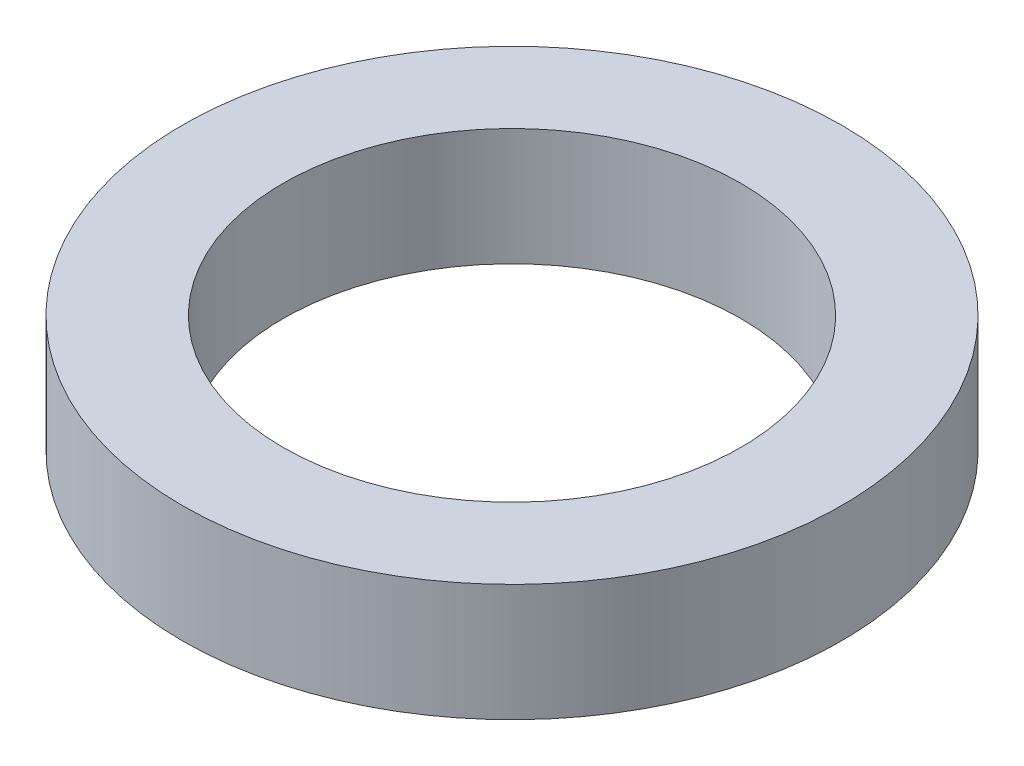
ISO-10303-21;
HEADER;
FILE_DESCRIPTION(('STEP AP214'),'2;1');
FILE_NAME('part.step','',(''),(''),'','','');
FILE_SCHEMA(('AUTOMOTIVE_DESIGN { 1 0 10303 214 1 1 1 1 }'));
ENDSEC;
DATA;
#1=APPLICATION_CONTEXT('core data for automotive mechanical design processes');
#2=APPLICATION_PROTOCOL_DEFINITION('international standard','automotive_design',2000,#1);
#3=PRODUCT_CONTEXT('',#1,'mechanical');
#4=PRODUCT('Part','Part','',(#3));
#5=PRODUCT_RELATED_PRODUCT_CATEGORY('part','',(#4));
#6=PRODUCT_DEFINITION_FORMATION('','',#4);
#7=PRODUCT_DEFINITION_CONTEXT('part definition',#1,'design');
#8=PRODUCT_DEFINITION('design','',#6,#7);
#9=PRODUCT_DEFINITION_SHAPE('','',#8);
#10=(LENGTH_UNIT() NAMED_UNIT(*) SI_UNIT(.MILLI.,.METRE.));
#11=(NAMED_UNIT(*) PLANE_ANGLE_UNIT() SI_UNIT($,.RADIAN.));
#12=(NAMED_UNIT(*) SI_UNIT($,.STERADIAN.) SOLID_ANGLE_UNIT());
#13=UNCERTAINTY_MEASURE_WITH_UNIT(LENGTH_MEASURE(1.E-05),#10,'distance_accuracy_value','');
#14=(GEOMETRIC_REPRESENTATION_CONTEXT(3) GLOBAL_UNCERTAINTY_ASSIGNED_CONTEXT((#13)) GLOBAL_UNIT_ASSIGNED_CONTEXT((#10,
#11,#12)) REPRESENTATION_CONTEXT('',''));
#15=CARTESIAN_POINT('',(0.,0.,0.));
#16=DIRECTION('',(0.,0.,1.));
#17=DIRECTION('',(1.,0.,0.));
#18=AXIS2_PLACEMENT_3D('',#15,#16,#17);
#19=CARTESIAN_POINT('',(0.,0.8128,0.));
#20=DIRECTION('',(0.,-1.,0.));
#21=DIRECTION('',(0.,0.,-1.));
#22=AXIS2_PLACEMENT_3D('',#19,#20,#21);
#23=CYLINDRICAL_SURFACE('',#22,2.286);
#24=CARTESIAN_POINT('',(0.,0.8128,0.));
#25=DIRECTION('',(0.,1.,0.));
#26=DIRECTION('',(0.,0.,1.));
#27=AXIS2_PLACEMENT_3D('',#24,#25,#26);
#28=CIRCLE('',#27,2.286);
#29=CARTESIAN_POINT('',(0.,0.8128,2.286));
#30=VERTEX_POINT('',#29);
#31=EDGE_CURVE('E10',#30,#30,#28,.T.);
#32=ORIENTED_EDGE('',*,*,#31,.F.);
#33=EDGE_LOOP('',(#32));
#34=FACE_BOUND('',#33,.T.);
#35=CARTESIAN_POINT('',(0.,0.,0.));
#36=DIRECTION('',(0.,1.,0.));
#37=DIRECTION('',(0.,0.,1.));
#38=AXIS2_PLACEMENT_3D('',#35,#36,#37);
#39=CIRCLE('',#38,2.286);
#40=CARTESIAN_POINT('',(0.,0.,2.286));
#41=VERTEX_POINT('',#40);
#42=EDGE_CURVE('E35',#41,#41,#39,.T.);
#43=ORIENTED_EDGE('',*,*,#42,.T.);
#44=EDGE_LOOP('',(#43));
#45=FACE_BOUND('',#44,.T.);
#46=ADVANCED_FACE('F32',(#34,#45),#23,.T.);
#47=CARTESIAN_POINT('',(0.,0.8128,0.));
#48=DIRECTION('',(0.,1.,0.));
#49=DIRECTION('',(0.,0.,1.));
#50=AXIS2_PLACEMENT_3D('',#47,#48,#49);
#51=PLANE('',#50);
#52=CARTESIAN_POINT('',(0.,0.8128,0.));
#53=DIRECTION('',(0.,1.,0.));
#54=DIRECTION('',(0.,0.,1.));
#55=AXIS2_PLACEMENT_3D('',#52,#53,#54);
#56=CIRCLE('',#55,1.5875);
#57=CARTESIAN_POINT('',(0.,0.8128,1.5875));
#58=VERTEX_POINT('',#57);
#59=EDGE_CURVE('E44',#58,#58,#56,.T.);
#60=ORIENTED_EDGE('',*,*,#59,.F.);
#61=EDGE_LOOP('',(#60));
#62=FACE_BOUND('',#61,.T.);
#63=ORIENTED_EDGE('',*,*,#31,.T.);
#64=EDGE_LOOP('',(#63));
#65=FACE_BOUND('',#64,.T.);
#66=ADVANCED_FACE('F59',(#62,#65),#51,.T.);
#67=CARTESIAN_POINT('',(0.,0.,0.));
#68=DIRECTION('',(0.,1.,0.));
#69=DIRECTION('',(0.,0.,1.));
#70=AXIS2_PLACEMENT_3D('',#67,#68,#69);
#71=PLANE('',#70);
#72=CARTESIAN_POINT('',(0.,0.,0.));
#73=DIRECTION('',(0.,1.,0.));
#74=DIRECTION('',(0.,0.,1.));
#75=AXIS2_PLACEMENT_3D('',#72,#73,#74);
#76=CIRCLE('',#75,1.5875);
#77=CARTESIAN_POINT('',(0.,0.,1.5875));
#78=VERTEX_POINT('',#77);
#79=EDGE_CURVE('E42',#78,#78,#76,.T.);
#80=ORIENTED_EDGE('',*,*,#79,.T.);
#81=EDGE_LOOP('',(#80));
#82=FACE_BOUND('',#81,.T.);
#83=ORIENTED_EDGE('',*,*,#42,.F.);
#84=EDGE_LOOP('',(#83));
#85=FACE_BOUND('',#84,.T.);
#86=ADVANCED_FACE('F50',(#82,#85),#71,.F.);
#87=CARTESIAN_POINT('',(0.,0.,0.));
#88=DIRECTION('',(0.,1.,0.));
#89=DIRECTION('',(0.,0.,1.));
#90=AXIS2_PLACEMENT_3D('',#87,#88,#89);
#91=CYLINDRICAL_SURFACE('',#90,1.5875);
#92=ORIENTED_EDGE('',*,*,#79,.F.);
#93=EDGE_LOOP('',(#92));
#94=FACE_BOUND('',#93,.T.);
#95=ORIENTED_EDGE('',*,*,#59,.T.);
#96=EDGE_LOOP('',(#95));
#97=FACE_BOUND('',#96,.T.);
#98=ADVANCED_FACE('F53',(#94,#97),#91,.F.);
#99=CLOSED_SHELL('',(#46,#66,#86,#98));
#100=MANIFOLD_SOLID_BREP('B2',#99);
#101=ADVANCED_BREP_SHAPE_REPRESENTATION('',(#18,#100),#14);
#102=SHAPE_DEFINITION_REPRESENTATION(#9,#101);
ENDSEC;
END-ISO-10303-21;
